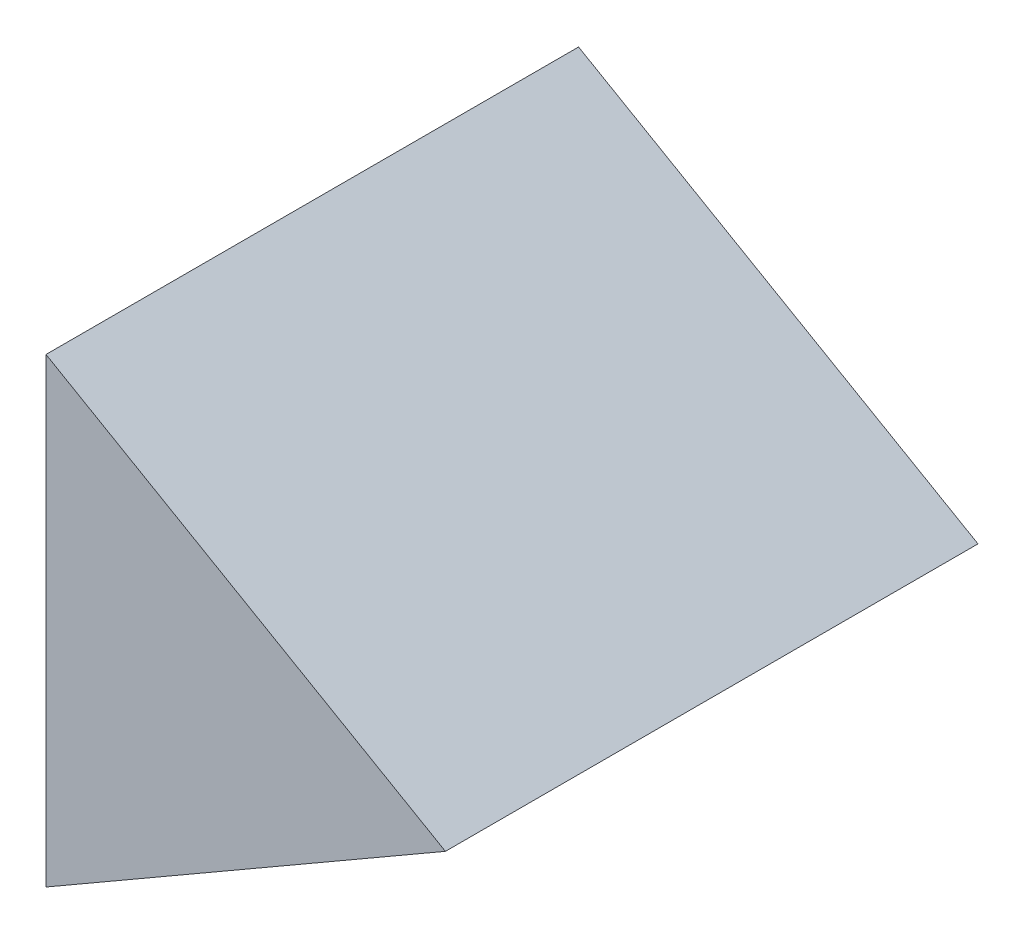
ISO-10303-21;
HEADER;
FILE_DESCRIPTION(('STEP AP214'),'2;1');
FILE_NAME('part.step','',(''),(''),'','','');
FILE_SCHEMA(('AUTOMOTIVE_DESIGN { 1 0 10303 214 1 1 1 1 }'));
ENDSEC;
DATA;
#1=APPLICATION_CONTEXT('core data for automotive mechanical design processes');
#2=APPLICATION_PROTOCOL_DEFINITION('international standard','automotive_design',2000,#1);
#3=PRODUCT_CONTEXT('',#1,'mechanical');
#4=PRODUCT('Part','Part','',(#3));
#5=PRODUCT_RELATED_PRODUCT_CATEGORY('part','',(#4));
#6=PRODUCT_DEFINITION_FORMATION('','',#4);
#7=PRODUCT_DEFINITION_CONTEXT('part definition',#1,'design');
#8=PRODUCT_DEFINITION('design','',#6,#7);
#9=PRODUCT_DEFINITION_SHAPE('','',#8);
#10=(LENGTH_UNIT() NAMED_UNIT(*) SI_UNIT(.MILLI.,.METRE.));
#11=(NAMED_UNIT(*) PLANE_ANGLE_UNIT() SI_UNIT($,.RADIAN.));
#12=(NAMED_UNIT(*) SI_UNIT($,.STERADIAN.) SOLID_ANGLE_UNIT());
#13=UNCERTAINTY_MEASURE_WITH_UNIT(LENGTH_MEASURE(1.E-05),#10,'distance_accuracy_value','');
#14=(GEOMETRIC_REPRESENTATION_CONTEXT(3) GLOBAL_UNCERTAINTY_ASSIGNED_CONTEXT((#13)) GLOBAL_UNIT_ASSIGNED_CONTEXT((#10,
#11,#12)) REPRESENTATION_CONTEXT('',''));
#15=CARTESIAN_POINT('',(0.,0.,0.));
#16=DIRECTION('',(0.,0.,1.));
#17=DIRECTION('',(1.,0.,0.));
#18=AXIS2_PLACEMENT_3D('',#15,#16,#17);
#19=CARTESIAN_POINT('',(-199.999999999997,-346.410161513777,800.));
#20=DIRECTION('',(-0.500000000000004,0.866025403784436,0.));
#21=DIRECTION('',(-0.866025403784436,-0.500000000000004,0.));
#22=AXIS2_PLACEMENT_3D('',#19,#20,#21);
#23=PLANE('',#22);
#24=DIRECTION('',(0.866025403784436,0.500000000000004,0.));
#25=VECTOR('',#24,1.);
#26=CARTESIAN_POINT('',(-199.999999999997,-346.410161513777,0.));
#27=LINE('',#26,#25);
#28=CARTESIAN_POINT('',(-199.999999999997,-346.410161513777,0.));
#29=VERTEX_POINT('',#28);
#30=CARTESIAN_POINT('',(400.,0.,0.));
#31=VERTEX_POINT('',#30);
#32=EDGE_CURVE('E89',#29,#31,#27,.T.);
#33=ORIENTED_EDGE('',*,*,#32,.T.);
#34=DIRECTION('',(0.,0.,-1.));
#35=VECTOR('',#34,1.);
#36=CARTESIAN_POINT('',(400.,0.,800.));
#37=LINE('',#36,#35);
#38=CARTESIAN_POINT('',(400.,0.,800.));
#39=VERTEX_POINT('',#38);
#40=EDGE_CURVE('E11',#39,#31,#37,.T.);
#41=ORIENTED_EDGE('',*,*,#40,.F.);
#42=DIRECTION('',(0.866025403784436,0.500000000000004,0.));
#43=VECTOR('',#42,1.);
#44=CARTESIAN_POINT('',(-199.999999999997,-346.410161513777,800.));
#45=LINE('',#44,#43);
#46=CARTESIAN_POINT('',(-199.999999999997,-346.410161513777,800.));
#47=VERTEX_POINT('',#46);
#48=EDGE_CURVE('E82',#47,#39,#45,.T.);
#49=ORIENTED_EDGE('',*,*,#48,.F.);
#50=DIRECTION('',(0.,0.,-1.));
#51=VECTOR('',#50,1.);
#52=CARTESIAN_POINT('',(-199.999999999997,-346.410161513777,800.));
#53=LINE('',#52,#51);
#54=EDGE_CURVE('E90',#47,#29,#53,.T.);
#55=ORIENTED_EDGE('',*,*,#54,.T.);
#56=EDGE_LOOP('',(#33,#41,#49,#55));
#57=FACE_BOUND('',#56,.T.);
#58=ADVANCED_FACE('F41',(#57),#23,.F.);
#59=CARTESIAN_POINT('',(400.,0.,800.));
#60=DIRECTION('',(-0.499999999999998,-0.86602540378444,0.));
#61=DIRECTION('',(0.86602540378444,-0.499999999999998,0.));
#62=AXIS2_PLACEMENT_3D('',#59,#60,#61);
#63=PLANE('',#62);
#64=DIRECTION('',(-0.86602540378444,0.499999999999998,0.));
#65=VECTOR('',#64,1.);
#66=CARTESIAN_POINT('',(400.,0.,0.));
#67=LINE('',#66,#65);
#68=CARTESIAN_POINT('',(-200.000000000002,346.410161513775,0.));
#69=VERTEX_POINT('',#68);
#70=EDGE_CURVE('E70',#31,#69,#67,.T.);
#71=ORIENTED_EDGE('',*,*,#70,.T.);
#72=DIRECTION('',(0.,0.,-1.));
#73=VECTOR('',#72,1.);
#74=CARTESIAN_POINT('',(-200.000000000002,346.410161513775,800.));
#75=LINE('',#74,#73);
#76=CARTESIAN_POINT('',(-200.000000000002,346.410161513775,800.));
#77=VERTEX_POINT('',#76);
#78=EDGE_CURVE('E50',#77,#69,#75,.T.);
#79=ORIENTED_EDGE('',*,*,#78,.F.);
#80=DIRECTION('',(-0.86602540378444,0.499999999999998,0.));
#81=VECTOR('',#80,1.);
#82=CARTESIAN_POINT('',(400.,0.,800.));
#83=LINE('',#82,#81);
#84=EDGE_CURVE('E78',#39,#77,#83,.T.);
#85=ORIENTED_EDGE('',*,*,#84,.F.);
#86=ORIENTED_EDGE('',*,*,#40,.T.);
#87=EDGE_LOOP('',(#71,#79,#85,#86));
#88=FACE_BOUND('',#87,.T.);
#89=ADVANCED_FACE('F79',(#88),#63,.F.);
#90=CARTESIAN_POINT('',(-200.000000000002,346.410161513775,800.));
#91=DIRECTION('',(1.,0.,0.));
#92=DIRECTION('',(0.,1.,0.));
#93=AXIS2_PLACEMENT_3D('',#90,#91,#92);
#94=PLANE('',#93);
#95=DIRECTION('',(0.,-1.,0.));
#96=VECTOR('',#95,1.);
#97=CARTESIAN_POINT('',(-200.000000000002,346.410161513775,0.));
#98=LINE('',#97,#96);
#99=EDGE_CURVE('E75',#69,#29,#98,.T.);
#100=ORIENTED_EDGE('',*,*,#99,.T.);
#101=ORIENTED_EDGE('',*,*,#54,.F.);
#102=DIRECTION('',(0.,-1.,0.));
#103=VECTOR('',#102,1.);
#104=CARTESIAN_POINT('',(-200.000000000002,346.410161513775,800.));
#105=LINE('',#104,#103);
#106=EDGE_CURVE('E58',#77,#47,#105,.T.);
#107=ORIENTED_EDGE('',*,*,#106,.F.);
#108=ORIENTED_EDGE('',*,*,#78,.T.);
#109=EDGE_LOOP('',(#100,#101,#107,#108));
#110=FACE_BOUND('',#109,.T.);
#111=ADVANCED_FACE('F97',(#110),#94,.F.);
#112=CARTESIAN_POINT('',(0.,0.,800.));
#113=DIRECTION('',(0.,0.,1.));
#114=DIRECTION('',(1.,0.,0.));
#115=AXIS2_PLACEMENT_3D('',#112,#113,#114);
#116=PLANE('',#115);
#117=ORIENTED_EDGE('',*,*,#48,.T.);
#118=ORIENTED_EDGE('',*,*,#84,.T.);
#119=ORIENTED_EDGE('',*,*,#106,.T.);
#120=EDGE_LOOP('',(#117,#118,#119));
#121=FACE_BOUND('',#120,.T.);
#122=ADVANCED_FACE('F85',(#121),#116,.T.);
#123=CARTESIAN_POINT('',(0.,0.,0.));
#124=DIRECTION('',(0.,0.,1.));
#125=DIRECTION('',(1.,0.,0.));
#126=AXIS2_PLACEMENT_3D('',#123,#124,#125);
#127=PLANE('',#126);
#128=ORIENTED_EDGE('',*,*,#32,.F.);
#129=ORIENTED_EDGE('',*,*,#99,.F.);
#130=ORIENTED_EDGE('',*,*,#70,.F.);
#131=EDGE_LOOP('',(#128,#129,#130));
#132=FACE_BOUND('',#131,.T.);
#133=ADVANCED_FACE('F43',(#132),#127,.F.);
#134=CLOSED_SHELL('',(#58,#89,#111,#122,#133));
#135=MANIFOLD_SOLID_BREP('B2',#134);
#136=ADVANCED_BREP_SHAPE_REPRESENTATION('',(#18,#135),#14);
#137=SHAPE_DEFINITION_REPRESENTATION(#9,#136);
ENDSEC;
END-ISO-10303-21;
